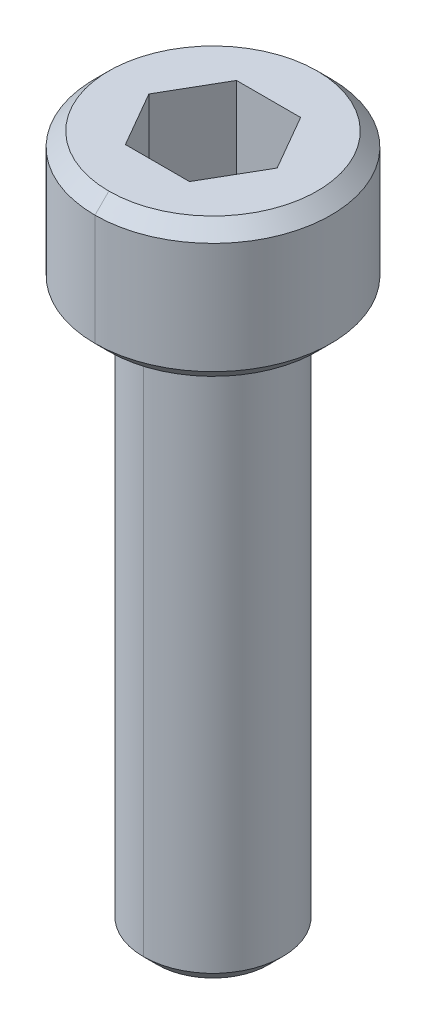
ISO-10303-21;
HEADER;
FILE_DESCRIPTION(('STEP AP214'),'2;1');
FILE_NAME('part.step','',(''),(''),'','','');
FILE_SCHEMA(('AUTOMOTIVE_DESIGN { 1 0 10303 214 1 1 1 1 }'));
ENDSEC;
DATA;
#1=APPLICATION_CONTEXT('core data for automotive mechanical design processes');
#2=APPLICATION_PROTOCOL_DEFINITION('international standard','automotive_design',2000,#1);
#3=PRODUCT_CONTEXT('',#1,'mechanical');
#4=PRODUCT('Part','Part','',(#3));
#5=PRODUCT_RELATED_PRODUCT_CATEGORY('part','',(#4));
#6=PRODUCT_DEFINITION_FORMATION('','',#4);
#7=PRODUCT_DEFINITION_CONTEXT('part definition',#1,'design');
#8=PRODUCT_DEFINITION('design','',#6,#7);
#9=PRODUCT_DEFINITION_SHAPE('','',#8);
#10=(LENGTH_UNIT() NAMED_UNIT(*) SI_UNIT(.MILLI.,.METRE.));
#11=(NAMED_UNIT(*) PLANE_ANGLE_UNIT() SI_UNIT($,.RADIAN.));
#12=(NAMED_UNIT(*) SI_UNIT($,.STERADIAN.) SOLID_ANGLE_UNIT());
#13=UNCERTAINTY_MEASURE_WITH_UNIT(LENGTH_MEASURE(1.E-05),#10,'distance_accuracy_value','');
#14=(GEOMETRIC_REPRESENTATION_CONTEXT(3) GLOBAL_UNCERTAINTY_ASSIGNED_CONTEXT((#13)) GLOBAL_UNIT_ASSIGNED_CONTEXT((#10,
#11,#12)) REPRESENTATION_CONTEXT('',''));
#15=CARTESIAN_POINT('',(0.,0.,0.));
#16=DIRECTION('',(0.,0.,1.));
#17=DIRECTION('',(1.,0.,0.));
#18=AXIS2_PLACEMENT_3D('',#15,#16,#17);
#19=CARTESIAN_POINT('',(2.3094010767585,22.,0.));
#20=DIRECTION('',(0.,1.,0.));
#21=DIRECTION('',(0.,0.,1.));
#22=AXIS2_PLACEMENT_3D('',#19,#20,#21);
#23=PLANE('',#22);
#24=DIRECTION('',(-1.,0.,0.));
#25=VECTOR('',#24,1.);
#26=CARTESIAN_POINT('',(1.15470053837925,22.,-2.));
#27=LINE('',#26,#25);
#28=CARTESIAN_POINT('',(1.15470053837925,22.,-2.));
#29=VERTEX_POINT('',#28);
#30=CARTESIAN_POINT('',(-1.15470053837925,22.,-2.));
#31=VERTEX_POINT('',#30);
#32=EDGE_CURVE('E179',#29,#31,#27,.T.);
#33=ORIENTED_EDGE('',*,*,#32,.T.);
#34=DIRECTION('',(-0.5,0.,0.866025403784439));
#35=VECTOR('',#34,1.);
#36=CARTESIAN_POINT('',(-1.15470053837925,22.,-2.));
#37=LINE('',#36,#35);
#38=CARTESIAN_POINT('',(-2.3094010767585,22.,0.));
#39=VERTEX_POINT('',#38);
#40=EDGE_CURVE('E158',#31,#39,#37,.T.);
#41=ORIENTED_EDGE('',*,*,#40,.T.);
#42=DIRECTION('',(0.5,0.,0.866025403784438));
#43=VECTOR('',#42,1.);
#44=CARTESIAN_POINT('',(-2.3094010767585,22.,0.));
#45=LINE('',#44,#43);
#46=CARTESIAN_POINT('',(-1.15470053837925,22.,2.));
#47=VERTEX_POINT('',#46);
#48=EDGE_CURVE('E165',#39,#47,#45,.T.);
#49=ORIENTED_EDGE('',*,*,#48,.T.);
#50=DIRECTION('',(1.,0.,0.));
#51=VECTOR('',#50,1.);
#52=CARTESIAN_POINT('',(-1.15470053837925,22.,2.));
#53=LINE('',#52,#51);
#54=CARTESIAN_POINT('',(1.15470053837925,22.,2.));
#55=VERTEX_POINT('',#54);
#56=EDGE_CURVE('E169',#47,#55,#53,.T.);
#57=ORIENTED_EDGE('',*,*,#56,.T.);
#58=DIRECTION('',(0.5,0.,-0.866025403784438));
#59=VECTOR('',#58,1.);
#60=CARTESIAN_POINT('',(1.15470053837925,22.,2.));
#61=LINE('',#60,#59);
#62=CARTESIAN_POINT('',(2.3094010767585,22.,0.));
#63=VERTEX_POINT('',#62);
#64=EDGE_CURVE('E173',#55,#63,#61,.T.);
#65=ORIENTED_EDGE('',*,*,#64,.T.);
#66=DIRECTION('',(-0.5,0.,-0.866025403784438));
#67=VECTOR('',#66,1.);
#68=CARTESIAN_POINT('',(2.3094010767585,22.,0.));
#69=LINE('',#68,#67);
#70=EDGE_CURVE('E177',#63,#29,#69,.T.);
#71=ORIENTED_EDGE('',*,*,#70,.T.);
#72=EDGE_LOOP('',(#33,#41,#49,#57,#65,#71));
#73=FACE_BOUND('',#72,.T.);
#74=ADVANCED_FACE('F17',(#73),#23,.T.);
#75=CARTESIAN_POINT('',(1.15470053837925,22.,-2.));
#76=DIRECTION('',(0.,0.,-1.));
#77=DIRECTION('',(-1.,0.,0.));
#78=AXIS2_PLACEMENT_3D('',#75,#76,#77);
#79=PLANE('',#78);
#80=ORIENTED_EDGE('',*,*,#32,.F.);
#81=DIRECTION('',(0.,1.,0.));
#82=VECTOR('',#81,1.);
#83=CARTESIAN_POINT('',(1.15470053837925,22.,-2.));
#84=LINE('',#83,#82);
#85=CARTESIAN_POINT('',(1.15470053837925,25.,-2.));
#86=VERTEX_POINT('',#85);
#87=EDGE_CURVE('E175',#29,#86,#84,.T.);
#88=ORIENTED_EDGE('',*,*,#87,.T.);
#89=DIRECTION('',(1.,0.,0.));
#90=VECTOR('',#89,1.);
#91=CARTESIAN_POINT('',(0.,25.,-2.));
#92=LINE('',#91,#90);
#93=CARTESIAN_POINT('',(-1.15470053837925,25.,-2.));
#94=VERTEX_POINT('',#93);
#95=EDGE_CURVE('E153',#94,#86,#92,.T.);
#96=ORIENTED_EDGE('',*,*,#95,.F.);
#97=DIRECTION('',(0.,1.,0.));
#98=VECTOR('',#97,1.);
#99=CARTESIAN_POINT('',(-1.15470053837925,22.,-2.));
#100=LINE('',#99,#98);
#101=EDGE_CURVE('E160',#94,#31,#100,.F.);
#102=ORIENTED_EDGE('',*,*,#101,.T.);
#103=EDGE_LOOP('',(#80,#88,#96,#102));
#104=FACE_BOUND('',#103,.T.);
#105=ADVANCED_FACE('F415',(#104),#79,.F.);
#106=CARTESIAN_POINT('',(2.3094010767585,22.,0.));
#107=DIRECTION('',(0.866025403784438,0.,-0.5));
#108=DIRECTION('',(-0.5,0.,-0.866025403784438));
#109=AXIS2_PLACEMENT_3D('',#106,#107,#108);
#110=PLANE('',#109);
#111=ORIENTED_EDGE('',*,*,#70,.F.);
#112=DIRECTION('',(0.,1.,0.));
#113=VECTOR('',#112,1.);
#114=CARTESIAN_POINT('',(2.3094010767585,22.,0.));
#115=LINE('',#114,#113);
#116=CARTESIAN_POINT('',(2.3094010767585,25.,0.));
#117=VERTEX_POINT('',#116);
#118=EDGE_CURVE('E171',#63,#117,#115,.T.);
#119=ORIENTED_EDGE('',*,*,#118,.T.);
#120=DIRECTION('',(0.500000000000001,0.,0.866025403784438));
#121=VECTOR('',#120,1.);
#122=CARTESIAN_POINT('',(1.15470053837925,25.,-2.));
#123=LINE('',#122,#121);
#124=EDGE_CURVE('E150',#86,#117,#123,.T.);
#125=ORIENTED_EDGE('',*,*,#124,.F.);
#126=ORIENTED_EDGE('',*,*,#87,.F.);
#127=EDGE_LOOP('',(#111,#119,#125,#126));
#128=FACE_BOUND('',#127,.T.);
#129=ADVANCED_FACE('F406',(#128),#110,.F.);
#130=CARTESIAN_POINT('',(1.15470053837925,22.,2.));
#131=DIRECTION('',(0.866025403784438,0.,0.5));
#132=DIRECTION('',(0.5,0.,-0.866025403784438));
#133=AXIS2_PLACEMENT_3D('',#130,#131,#132);
#134=PLANE('',#133);
#135=ORIENTED_EDGE('',*,*,#64,.F.);
#136=DIRECTION('',(0.,1.,0.));
#137=VECTOR('',#136,1.);
#138=CARTESIAN_POINT('',(1.15470053837925,22.,2.));
#139=LINE('',#138,#137);
#140=CARTESIAN_POINT('',(1.15470053837925,25.,2.));
#141=VERTEX_POINT('',#140);
#142=EDGE_CURVE('E167',#55,#141,#139,.T.);
#143=ORIENTED_EDGE('',*,*,#142,.T.);
#144=DIRECTION('',(-0.5,0.,0.866025403784438));
#145=VECTOR('',#144,1.);
#146=CARTESIAN_POINT('',(2.3094010767585,25.,0.));
#147=LINE('',#146,#145);
#148=EDGE_CURVE('E147',#117,#141,#147,.T.);
#149=ORIENTED_EDGE('',*,*,#148,.F.);
#150=ORIENTED_EDGE('',*,*,#118,.F.);
#151=EDGE_LOOP('',(#135,#143,#149,#150));
#152=FACE_BOUND('',#151,.T.);
#153=ADVANCED_FACE('F397',(#152),#134,.F.);
#154=CARTESIAN_POINT('',(-1.15470053837925,22.,2.));
#155=DIRECTION('',(0.,0.,1.));
#156=DIRECTION('',(1.,0.,0.));
#157=AXIS2_PLACEMENT_3D('',#154,#155,#156);
#158=PLANE('',#157);
#159=ORIENTED_EDGE('',*,*,#56,.F.);
#160=DIRECTION('',(0.,1.,0.));
#161=VECTOR('',#160,1.);
#162=CARTESIAN_POINT('',(-1.15470053837925,22.,2.));
#163=LINE('',#162,#161);
#164=CARTESIAN_POINT('',(-1.15470053837925,25.,2.));
#165=VERTEX_POINT('',#164);
#166=EDGE_CURVE('E163',#47,#165,#163,.T.);
#167=ORIENTED_EDGE('',*,*,#166,.T.);
#168=DIRECTION('',(1.,0.,0.));
#169=VECTOR('',#168,1.);
#170=CARTESIAN_POINT('',(0.,25.,2.));
#171=LINE('',#170,#169);
#172=EDGE_CURVE('E144',#141,#165,#171,.F.);
#173=ORIENTED_EDGE('',*,*,#172,.F.);
#174=ORIENTED_EDGE('',*,*,#142,.F.);
#175=EDGE_LOOP('',(#159,#167,#173,#174));
#176=FACE_BOUND('',#175,.T.);
#177=ADVANCED_FACE('F388',(#176),#158,.F.);
#178=CARTESIAN_POINT('',(-2.3094010767585,22.,0.));
#179=DIRECTION('',(-0.866025403784438,0.,0.5));
#180=DIRECTION('',(0.5,0.,0.866025403784438));
#181=AXIS2_PLACEMENT_3D('',#178,#179,#180);
#182=PLANE('',#181);
#183=ORIENTED_EDGE('',*,*,#48,.F.);
#184=DIRECTION('',(0.,1.,0.));
#185=VECTOR('',#184,1.);
#186=CARTESIAN_POINT('',(-2.3094010767585,22.,0.));
#187=LINE('',#186,#185);
#188=CARTESIAN_POINT('',(-2.3094010767585,25.,0.));
#189=VERTEX_POINT('',#188);
#190=EDGE_CURVE('E156',#39,#189,#187,.T.);
#191=ORIENTED_EDGE('',*,*,#190,.T.);
#192=DIRECTION('',(-0.5,0.,-0.866025403784439));
#193=VECTOR('',#192,1.);
#194=CARTESIAN_POINT('',(-1.15470053837925,25.,2.));
#195=LINE('',#194,#193);
#196=EDGE_CURVE('E141',#165,#189,#195,.T.);
#197=ORIENTED_EDGE('',*,*,#196,.F.);
#198=ORIENTED_EDGE('',*,*,#166,.F.);
#199=EDGE_LOOP('',(#183,#191,#197,#198));
#200=FACE_BOUND('',#199,.T.);
#201=ADVANCED_FACE('F379',(#200),#182,.F.);
#202=CARTESIAN_POINT('',(-1.15470053837925,22.,-2.));
#203=DIRECTION('',(-0.866025403784439,0.,-0.5));
#204=DIRECTION('',(-0.5,0.,0.866025403784439));
#205=AXIS2_PLACEMENT_3D('',#202,#203,#204);
#206=PLANE('',#205);
#207=ORIENTED_EDGE('',*,*,#40,.F.);
#208=ORIENTED_EDGE('',*,*,#101,.F.);
#209=DIRECTION('',(0.5,0.,-0.866025403784439));
#210=VECTOR('',#209,1.);
#211=CARTESIAN_POINT('',(-2.3094010767585,25.,0.));
#212=LINE('',#211,#210);
#213=EDGE_CURVE('E122',#189,#94,#212,.T.);
#214=ORIENTED_EDGE('',*,*,#213,.F.);
#215=ORIENTED_EDGE('',*,*,#190,.F.);
#216=EDGE_LOOP('',(#207,#208,#214,#215));
#217=FACE_BOUND('',#216,.T.);
#218=ADVANCED_FACE('F371',(#217),#206,.F.);
#219=CARTESIAN_POINT('',(0.,25.,-4.25));
#220=DIRECTION('',(0.,1.,0.));
#221=DIRECTION('',(0.,0.,1.));
#222=AXIS2_PLACEMENT_3D('',#219,#220,#221);
#223=PLANE('',#222);
#224=CARTESIAN_POINT('',(0.,25.0000000000341,0.));
#225=DIRECTION('',(0.,-1.,0.));
#226=DIRECTION('',(1.,0.,0.));
#227=AXIS2_PLACEMENT_3D('',#224,#225,#226);
#228=CIRCLE('',#227,3.74999999996817);
#229=CARTESIAN_POINT('',(0.,25.0000000000341,-3.74999999996817));
#230=VERTEX_POINT('',#229);
#231=CARTESIAN_POINT('',(0.,25.0000000000341,3.74999999996817));
#232=VERTEX_POINT('',#231);
#233=EDGE_CURVE('E111',#230,#232,#228,.T.);
#234=ORIENTED_EDGE('',*,*,#233,.F.);
#235=CARTESIAN_POINT('',(0.,25.0000000000341,0.));
#236=DIRECTION('',(0.,-1.,0.));
#237=DIRECTION('',(1.,0.,0.));
#238=AXIS2_PLACEMENT_3D('',#235,#236,#237);
#239=CIRCLE('',#238,3.74999999996817);
#240=EDGE_CURVE('E20',#232,#230,#239,.T.);
#241=ORIENTED_EDGE('',*,*,#240,.F.);
#242=EDGE_LOOP('',(#234,#241));
#243=FACE_BOUND('',#242,.T.);
#244=ORIENTED_EDGE('',*,*,#196,.T.);
#245=ORIENTED_EDGE('',*,*,#213,.T.);
#246=ORIENTED_EDGE('',*,*,#95,.T.);
#247=ORIENTED_EDGE('',*,*,#124,.T.);
#248=ORIENTED_EDGE('',*,*,#148,.T.);
#249=ORIENTED_EDGE('',*,*,#172,.T.);
#250=EDGE_LOOP('',(#244,#245,#246,#247,#248,#249));
#251=FACE_BOUND('',#250,.T.);
#252=ADVANCED_FACE('F112',(#243,#251),#223,.T.);
#253=CARTESIAN_POINT('',(0.,24.5000000001028,0.));
#254=DIRECTION('',(0.,-1.,0.));
#255=DIRECTION('',(1.,0.,0.));
#256=AXIS2_PLACEMENT_3D('',#253,#254,#255);
#257=CONICAL_SURFACE('',#256,4.2499999998995,0.785398163397448);
#258=DIRECTION('',(0.,0.707106781186548,0.707106781186548));
#259=VECTOR('',#258,1.);
#260=CARTESIAN_POINT('',(0.,-498971.25,-499000.));
#261=LINE('',#260,#259);
#262=CARTESIAN_POINT('',(0.,24.5000000000257,-4.24999999997488));
#263=VERTEX_POINT('',#262);
#264=EDGE_CURVE('E120',#263,#230,#261,.T.);
#265=ORIENTED_EDGE('',*,*,#264,.F.);
#266=CARTESIAN_POINT('',(0.,24.5,0.));
#267=DIRECTION('',(0.,-1.,0.));
#268=DIRECTION('',(0.,0.,-1.));
#269=AXIS2_PLACEMENT_3D('',#266,#267,#268);
#270=CIRCLE('',#269,4.25);
#271=CARTESIAN_POINT('',(0.,24.5000000000257,4.24999999997488));
#272=VERTEX_POINT('',#271);
#273=EDGE_CURVE('E127',#272,#263,#270,.T.);
#274=ORIENTED_EDGE('',*,*,#273,.F.);
#275=DIRECTION('',(0.,0.707106781186548,-0.707106781186548));
#276=VECTOR('',#275,1.);
#277=CARTESIAN_POINT('',(6.11098752774529E-11,-498971.25,499000.));
#278=LINE('',#277,#276);
#279=EDGE_CURVE('E117',#232,#272,#278,.F.);
#280=ORIENTED_EDGE('',*,*,#279,.F.);
#281=ORIENTED_EDGE('',*,*,#240,.T.);
#282=EDGE_LOOP('',(#265,#274,#280,#281));
#283=FACE_BOUND('',#282,.T.);
#284=ADVANCED_FACE('F119',(#283),#257,.T.);
#285=CARTESIAN_POINT('',(0.,24.5000000001028,0.));
#286=DIRECTION('',(0.,-1.,0.));
#287=DIRECTION('',(1.,0.,0.));
#288=AXIS2_PLACEMENT_3D('',#285,#286,#287);
#289=CONICAL_SURFACE('',#288,4.2499999998995,0.785398163397448);
#290=CARTESIAN_POINT('',(0.,24.5,0.));
#291=DIRECTION('',(0.,-1.,0.));
#292=DIRECTION('',(0.,0.,-1.));
#293=AXIS2_PLACEMENT_3D('',#290,#291,#292);
#294=CIRCLE('',#293,4.25);
#295=EDGE_CURVE('E125',#263,#272,#294,.T.);
#296=ORIENTED_EDGE('',*,*,#295,.F.);
#297=ORIENTED_EDGE('',*,*,#264,.T.);
#298=ORIENTED_EDGE('',*,*,#233,.T.);
#299=ORIENTED_EDGE('',*,*,#279,.T.);
#300=EDGE_LOOP('',(#296,#297,#298,#299));
#301=FACE_BOUND('',#300,.T.);
#302=ADVANCED_FACE('F123',(#301),#289,.T.);
#303=CARTESIAN_POINT('',(0.,0.,0.));
#304=DIRECTION('',(0.,-1.,0.));
#305=DIRECTION('',(0.,0.,-1.));
#306=AXIS2_PLACEMENT_3D('',#303,#304,#305);
#307=CYLINDRICAL_SURFACE('',#306,4.25);
#308=DIRECTION('',(0.,-1.,0.));
#309=VECTOR('',#308,1.);
#310=CARTESIAN_POINT('',(0.,0.,-4.25));
#311=LINE('',#310,#309);
#312=CARTESIAN_POINT('',(0.,20.4999999999274,-4.24999999998147));
#313=VERTEX_POINT('',#312);
#314=EDGE_CURVE('E224',#313,#263,#311,.F.);
#315=ORIENTED_EDGE('',*,*,#314,.F.);
#316=CARTESIAN_POINT('',(0.,20.49999999997,0.));
#317=DIRECTION('',(0.,1.,0.));
#318=DIRECTION('',(0.,0.,1.));
#319=AXIS2_PLACEMENT_3D('',#316,#317,#318);
#320=CIRCLE('',#319,4.25000000001319);
#321=CARTESIAN_POINT('',(0.,20.4999999999416,4.24999999998147));
#322=VERTEX_POINT('',#321);
#323=EDGE_CURVE('E219',#322,#313,#320,.F.);
#324=ORIENTED_EDGE('',*,*,#323,.F.);
#325=DIRECTION('',(0.,-1.,0.));
#326=VECTOR('',#325,1.);
#327=CARTESIAN_POINT('',(0.,0.,4.25));
#328=LINE('',#327,#326);
#329=EDGE_CURVE('E229',#272,#322,#328,.T.);
#330=ORIENTED_EDGE('',*,*,#329,.F.);
#331=ORIENTED_EDGE('',*,*,#273,.T.);
#332=EDGE_LOOP('',(#315,#324,#330,#331));
#333=FACE_BOUND('',#332,.T.);
#334=ADVANCED_FACE('F244',(#333),#307,.T.);
#335=CARTESIAN_POINT('',(0.,0.,0.));
#336=DIRECTION('',(0.,-1.,0.));
#337=DIRECTION('',(0.,0.,-1.));
#338=AXIS2_PLACEMENT_3D('',#335,#336,#337);
#339=CYLINDRICAL_SURFACE('',#338,4.25);
#340=CARTESIAN_POINT('',(0.,20.49999999997,0.));
#341=DIRECTION('',(0.,1.,0.));
#342=DIRECTION('',(0.,0.,1.));
#343=AXIS2_PLACEMENT_3D('',#340,#341,#342);
#344=CIRCLE('',#343,4.25000000001319);
#345=EDGE_CURVE('E204',#313,#322,#344,.F.);
#346=ORIENTED_EDGE('',*,*,#345,.F.);
#347=ORIENTED_EDGE('',*,*,#314,.T.);
#348=ORIENTED_EDGE('',*,*,#295,.T.);
#349=ORIENTED_EDGE('',*,*,#329,.T.);
#350=EDGE_LOOP('',(#346,#347,#348,#349));
#351=FACE_BOUND('',#350,.T.);
#352=ADVANCED_FACE('F241',(#351),#339,.T.);
#353=CARTESIAN_POINT('',(0.,20.4999999998563,0.));
#354=DIRECTION('',(0.,1.,0.));
#355=DIRECTION('',(0.,0.,1.));
#356=AXIS2_PLACEMENT_3D('',#353,#354,#355);
#357=CONICAL_SURFACE('',#356,4.2499999998995,0.785398163397448);
#358=DIRECTION('',(0.,-0.707106781186548,-0.707106781186548));
#359=VECTOR('',#358,1.);
#360=CARTESIAN_POINT('',(0.,499000.,498983.75));
#361=LINE('',#360,#359);
#362=CARTESIAN_POINT('',(0.,19.999999999925,3.74999999996817));
#363=VERTEX_POINT('',#362);
#364=EDGE_CURVE('E201',#322,#363,#361,.T.);
#365=ORIENTED_EDGE('',*,*,#364,.F.);
#366=ORIENTED_EDGE('',*,*,#323,.T.);
#367=DIRECTION('',(0.,-0.707106781186548,0.707106781186548));
#368=VECTOR('',#367,1.);
#369=CARTESIAN_POINT('',(6.11078852264043E-11,499000.,-498983.75));
#370=LINE('',#369,#368);
#371=CARTESIAN_POINT('',(0.,19.999999999925,-3.74999999996817));
#372=VERTEX_POINT('',#371);
#373=EDGE_CURVE('E210',#372,#313,#370,.F.);
#374=ORIENTED_EDGE('',*,*,#373,.F.);
#375=CARTESIAN_POINT('',(0.,19.999999999925,0.));
#376=DIRECTION('',(0.,1.,0.));
#377=DIRECTION('',(0.,0.,1.));
#378=AXIS2_PLACEMENT_3D('',#375,#376,#377);
#379=CIRCLE('',#378,3.74999999996817);
#380=EDGE_CURVE('E196',#363,#372,#379,.F.);
#381=ORIENTED_EDGE('',*,*,#380,.F.);
#382=EDGE_LOOP('',(#365,#366,#374,#381));
#383=FACE_BOUND('',#382,.T.);
#384=ADVANCED_FACE('F246',(#383),#357,.T.);
#385=CARTESIAN_POINT('',(0.,20.4999999998563,0.));
#386=DIRECTION('',(0.,1.,0.));
#387=DIRECTION('',(0.,0.,1.));
#388=AXIS2_PLACEMENT_3D('',#385,#386,#387);
#389=CONICAL_SURFACE('',#388,4.2499999998995,0.785398163397448);
#390=ORIENTED_EDGE('',*,*,#345,.T.);
#391=ORIENTED_EDGE('',*,*,#364,.T.);
#392=CARTESIAN_POINT('',(0.,19.999999999925,0.));
#393=DIRECTION('',(0.,1.,0.));
#394=DIRECTION('',(0.,0.,1.));
#395=AXIS2_PLACEMENT_3D('',#392,#393,#394);
#396=CIRCLE('',#395,3.74999999996817);
#397=EDGE_CURVE('E193',#372,#363,#396,.F.);
#398=ORIENTED_EDGE('',*,*,#397,.F.);
#399=ORIENTED_EDGE('',*,*,#373,.T.);
#400=EDGE_LOOP('',(#390,#391,#398,#399));
#401=FACE_BOUND('',#400,.T.);
#402=ADVANCED_FACE('F247',(#401),#389,.T.);
#403=CARTESIAN_POINT('',(0.,0.,0.));
#404=DIRECTION('',(0.,-1.,0.));
#405=DIRECTION('',(0.,0.,-1.));
#406=AXIS2_PLACEMENT_3D('',#403,#404,#405);
#407=PLANE('',#406);
#408=CARTESIAN_POINT('',(0.,0.,0.));
#409=DIRECTION('',(0.,1.,0.));
#410=DIRECTION('',(0.,0.,1.));
#411=AXIS2_PLACEMENT_3D('',#408,#409,#410);
#412=CIRCLE('',#411,1.99999999995271);
#413=CARTESIAN_POINT('',(0.,0.,1.99999999995271));
#414=VERTEX_POINT('',#413);
#415=CARTESIAN_POINT('',(0.,0.,-1.99999999995271));
#416=VERTEX_POINT('',#415);
#417=EDGE_CURVE('E189',#414,#416,#412,.T.);
#418=ORIENTED_EDGE('',*,*,#417,.F.);
#419=CARTESIAN_POINT('',(0.,0.,0.));
#420=DIRECTION('',(0.,1.,0.));
#421=DIRECTION('',(0.,0.,1.));
#422=AXIS2_PLACEMENT_3D('',#419,#420,#421);
#423=CIRCLE('',#422,1.99999999995271);
#424=EDGE_CURVE('E199',#416,#414,#423,.T.);
#425=ORIENTED_EDGE('',*,*,#424,.F.);
#426=EDGE_LOOP('',(#418,#425));
#427=FACE_BOUND('',#426,.T.);
#428=ADVANCED_FACE('F269',(#427),#407,.T.);
#429=CARTESIAN_POINT('',(0.,0.499999999988177,0.));
#430=DIRECTION('',(0.,1.,0.));
#431=DIRECTION('',(0.,0.,1.));
#432=AXIS2_PLACEMENT_3D('',#429,#430,#431);
#433=CONICAL_SURFACE('',#432,2.49999999999773,0.785398163454292);
#434=DIRECTION('',(0.,-0.707106781186548,-0.707106781186547));
#435=VECTOR('',#434,1.);
#436=CARTESIAN_POINT('',(0.,498998.,499000.));
#437=LINE('',#436,#435);
#438=CARTESIAN_POINT('',(0.,0.499999999992613,2.49999999999858));
#439=VERTEX_POINT('',#438);
#440=EDGE_CURVE('E188',#439,#414,#437,.T.);
#441=ORIENTED_EDGE('',*,*,#440,.F.);
#442=CARTESIAN_POINT('',(0.,0.500000000000007,0.));
#443=DIRECTION('',(0.,-1.,0.));
#444=DIRECTION('',(0.,0.,-1.));
#445=AXIS2_PLACEMENT_3D('',#442,#443,#444);
#446=CIRCLE('',#445,2.5);
#447=CARTESIAN_POINT('',(0.,0.499999999991134,-2.49999999999829));
#448=VERTEX_POINT('',#447);
#449=EDGE_CURVE('E35',#448,#439,#446,.F.);
#450=ORIENTED_EDGE('',*,*,#449,.F.);
#451=DIRECTION('',(0.,-0.707106781186548,0.707106781186547));
#452=VECTOR('',#451,1.);
#453=CARTESIAN_POINT('',(6.11098752774529E-11,498998.,-499000.));
#454=LINE('',#453,#452);
#455=EDGE_CURVE('E192',#416,#448,#454,.F.);
#456=ORIENTED_EDGE('',*,*,#455,.F.);
#457=ORIENTED_EDGE('',*,*,#424,.T.);
#458=EDGE_LOOP('',(#441,#450,#456,#457));
#459=FACE_BOUND('',#458,.T.);
#460=ADVANCED_FACE('F253',(#459),#433,.T.);
#461=CARTESIAN_POINT('',(0.,20.,-2.5));
#462=DIRECTION('',(0.,-1.,0.));
#463=DIRECTION('',(0.,0.,-1.));
#464=AXIS2_PLACEMENT_3D('',#461,#462,#463);
#465=PLANE('',#464);
#466=ORIENTED_EDGE('',*,*,#380,.T.);
#467=ORIENTED_EDGE('',*,*,#397,.T.);
#468=EDGE_LOOP('',(#466,#467));
#469=FACE_BOUND('',#468,.T.);
#470=CARTESIAN_POINT('',(0.,20.,0.));
#471=DIRECTION('',(0.,-1.,0.));
#472=DIRECTION('',(0.,0.,-1.));
#473=AXIS2_PLACEMENT_3D('',#470,#471,#472);
#474=CIRCLE('',#473,2.5);
#475=CARTESIAN_POINT('',(0.,20.,-2.5));
#476=VERTEX_POINT('',#475);
#477=CARTESIAN_POINT('',(0.,20.,2.5));
#478=VERTEX_POINT('',#477);
#479=EDGE_CURVE('E181',#476,#478,#474,.T.);
#480=ORIENTED_EDGE('',*,*,#479,.F.);
#481=CARTESIAN_POINT('',(0.,20.,0.));
#482=DIRECTION('',(0.,-1.,0.));
#483=DIRECTION('',(0.,0.,-1.));
#484=AXIS2_PLACEMENT_3D('',#481,#482,#483);
#485=CIRCLE('',#484,2.5);
#486=EDGE_CURVE('E185',#478,#476,#485,.T.);
#487=ORIENTED_EDGE('',*,*,#486,.F.);
#488=EDGE_LOOP('',(#480,#487));
#489=FACE_BOUND('',#488,.T.);
#490=ADVANCED_FACE('F249',(#469,#489),#465,.T.);
#491=CARTESIAN_POINT('',(0.,0.499999999988177,0.));
#492=DIRECTION('',(0.,1.,0.));
#493=DIRECTION('',(0.,0.,1.));
#494=AXIS2_PLACEMENT_3D('',#491,#492,#493);
#495=CONICAL_SURFACE('',#494,2.49999999999773,0.785398163454292);
#496=CARTESIAN_POINT('',(0.,0.500000000000007,0.));
#497=DIRECTION('',(0.,-1.,0.));
#498=DIRECTION('',(0.,0.,-1.));
#499=AXIS2_PLACEMENT_3D('',#496,#497,#498);
#500=CIRCLE('',#499,2.5);
#501=EDGE_CURVE('E26',#439,#448,#500,.F.);
#502=ORIENTED_EDGE('',*,*,#501,.F.);
#503=ORIENTED_EDGE('',*,*,#440,.T.);
#504=ORIENTED_EDGE('',*,*,#417,.T.);
#505=ORIENTED_EDGE('',*,*,#455,.T.);
#506=EDGE_LOOP('',(#502,#503,#504,#505));
#507=FACE_BOUND('',#506,.T.);
#508=ADVANCED_FACE('F252',(#507),#495,.T.);
#509=CARTESIAN_POINT('',(0.,0.,0.));
#510=DIRECTION('',(0.,-1.,0.));
#511=DIRECTION('',(0.,0.,-1.));
#512=AXIS2_PLACEMENT_3D('',#509,#510,#511);
#513=CYLINDRICAL_SURFACE('',#512,2.5);
#514=DIRECTION('',(0.,-1.,0.));
#515=VECTOR('',#514,1.);
#516=CARTESIAN_POINT('',(0.,0.,-2.5));
#517=LINE('',#516,#515);
#518=EDGE_CURVE('E11',#448,#476,#517,.F.);
#519=ORIENTED_EDGE('',*,*,#518,.F.);
#520=ORIENTED_EDGE('',*,*,#449,.T.);
#521=DIRECTION('',(0.,-1.,0.));
#522=VECTOR('',#521,1.);
#523=CARTESIAN_POINT('',(0.,0.,2.5));
#524=LINE('',#523,#522);
#525=EDGE_CURVE('E184',#478,#439,#524,.T.);
#526=ORIENTED_EDGE('',*,*,#525,.F.);
#527=ORIENTED_EDGE('',*,*,#486,.T.);
#528=EDGE_LOOP('',(#519,#520,#526,#527));
#529=FACE_BOUND('',#528,.T.);
#530=ADVANCED_FACE('F260',(#529),#513,.T.);
#531=CARTESIAN_POINT('',(0.,0.,0.));
#532=DIRECTION('',(0.,-1.,0.));
#533=DIRECTION('',(0.,0.,-1.));
#534=AXIS2_PLACEMENT_3D('',#531,#532,#533);
#535=CYLINDRICAL_SURFACE('',#534,2.5);
#536=ORIENTED_EDGE('',*,*,#501,.T.);
#537=ORIENTED_EDGE('',*,*,#518,.T.);
#538=ORIENTED_EDGE('',*,*,#479,.T.);
#539=ORIENTED_EDGE('',*,*,#525,.T.);
#540=EDGE_LOOP('',(#536,#537,#538,#539));
#541=FACE_BOUND('',#540,.T.);
#542=ADVANCED_FACE('F262',(#541),#535,.T.);
#543=CLOSED_SHELL('',(#74,#105,#129,#153,#177,#201,#218,#252,#284,#302,#334,#352,#384,#402,#428,
#460,#490,#508,#530,#542));
#544=MANIFOLD_SOLID_BREP('B1',#543);
#545=ADVANCED_BREP_SHAPE_REPRESENTATION('',(#18,#544),#14);
#546=SHAPE_DEFINITION_REPRESENTATION(#9,#545);
ENDSEC;
END-ISO-10303-21;
